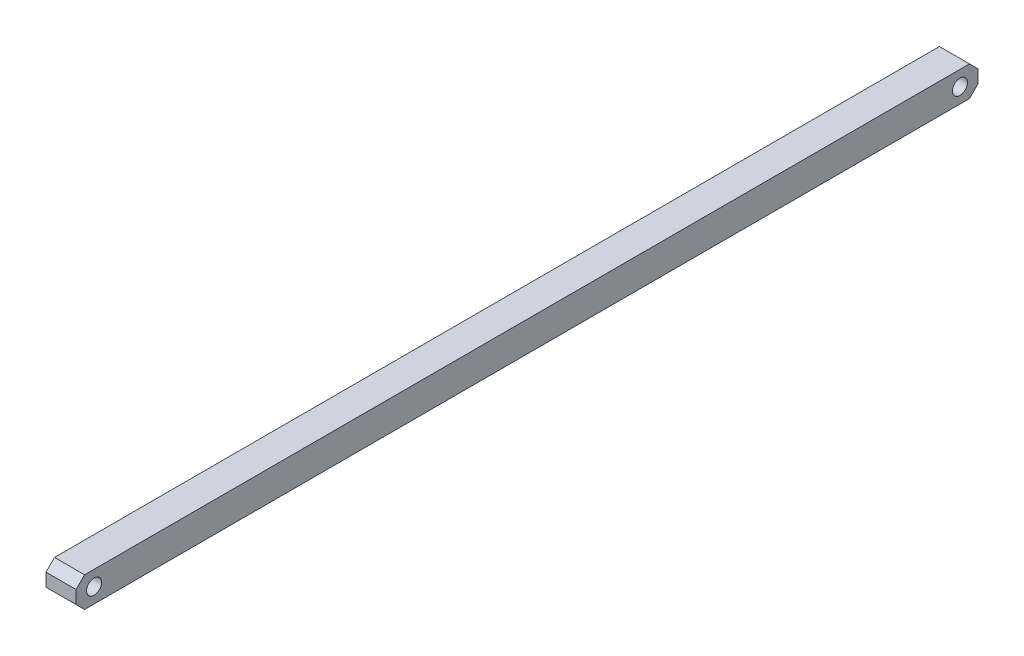
ISO-10303-21;
HEADER;
FILE_DESCRIPTION(('STEP AP214'),'2;1');
FILE_NAME('part.step','',(''),(''),'','','');
FILE_SCHEMA(('AUTOMOTIVE_DESIGN { 1 0 10303 214 1 1 1 1 }'));
ENDSEC;
DATA;
#1=APPLICATION_CONTEXT('core data for automotive mechanical design processes');
#2=APPLICATION_PROTOCOL_DEFINITION('international standard','automotive_design',2000,#1);
#3=PRODUCT_CONTEXT('',#1,'mechanical');
#4=PRODUCT('Part','Part','',(#3));
#5=PRODUCT_RELATED_PRODUCT_CATEGORY('part','',(#4));
#6=PRODUCT_DEFINITION_FORMATION('','',#4);
#7=PRODUCT_DEFINITION_CONTEXT('part definition',#1,'design');
#8=PRODUCT_DEFINITION('design','',#6,#7);
#9=PRODUCT_DEFINITION_SHAPE('','',#8);
#10=(LENGTH_UNIT() NAMED_UNIT(*) SI_UNIT(.MILLI.,.METRE.));
#11=(NAMED_UNIT(*) PLANE_ANGLE_UNIT() SI_UNIT($,.RADIAN.));
#12=(NAMED_UNIT(*) SI_UNIT($,.STERADIAN.) SOLID_ANGLE_UNIT());
#13=UNCERTAINTY_MEASURE_WITH_UNIT(LENGTH_MEASURE(1.E-05),#10,'distance_accuracy_value','');
#14=(GEOMETRIC_REPRESENTATION_CONTEXT(3) GLOBAL_UNCERTAINTY_ASSIGNED_CONTEXT((#13)) GLOBAL_UNIT_ASSIGNED_CONTEXT((#10,
#11,#12)) REPRESENTATION_CONTEXT('',''));
#15=CARTESIAN_POINT('',(0.,0.,0.));
#16=DIRECTION('',(0.,0.,1.));
#17=DIRECTION('',(1.,0.,0.));
#18=AXIS2_PLACEMENT_3D('',#15,#16,#17);
#19=CARTESIAN_POINT('',(0.,0.,300.));
#20=DIRECTION('',(1.,0.,0.));
#21=DIRECTION('',(0.,0.,-1.));
#22=AXIS2_PLACEMENT_3D('',#19,#20,#21);
#23=PLANE('',#22);
#24=CARTESIAN_POINT('',(0.,-5.,6.));
#25=DIRECTION('',(1.,0.,0.));
#26=DIRECTION('',(0.,1.,0.));
#27=AXIS2_PLACEMENT_3D('',#24,#25,#26);
#28=CIRCLE('',#27,2.5);
#29=CARTESIAN_POINT('',(0.,-2.5,6.));
#30=VERTEX_POINT('',#29);
#31=EDGE_CURVE('E165',#30,#30,#28,.T.);
#32=ORIENTED_EDGE('',*,*,#31,.T.);
#33=EDGE_LOOP('',(#32));
#34=FACE_BOUND('',#33,.T.);
#35=CARTESIAN_POINT('',(0.,-5.,294.));
#36=DIRECTION('',(1.,0.,0.));
#37=DIRECTION('',(0.,-1.,0.));
#38=AXIS2_PLACEMENT_3D('',#35,#36,#37);
#39=CIRCLE('',#38,2.49999999999997);
#40=CARTESIAN_POINT('',(0.,-7.49999999999997,294.));
#41=VERTEX_POINT('',#40);
#42=EDGE_CURVE('E174',#41,#41,#39,.T.);
#43=ORIENTED_EDGE('',*,*,#42,.T.);
#44=EDGE_LOOP('',(#43));
#45=FACE_BOUND('',#44,.T.);
#46=DIRECTION('',(0.,-1.,0.));
#47=VECTOR('',#46,1.);
#48=CARTESIAN_POINT('',(0.,0.,0.));
#49=LINE('',#48,#47);
#50=CARTESIAN_POINT('',(0.,-2.82842712474619,0.));
#51=VERTEX_POINT('',#50);
#52=CARTESIAN_POINT('',(0.,-7.17157287525381,0.));
#53=VERTEX_POINT('',#52);
#54=EDGE_CURVE('E134',#51,#53,#49,.T.);
#55=ORIENTED_EDGE('',*,*,#54,.T.);
#56=DIRECTION('',(0.,-0.707106781186548,0.707106781186548));
#57=VECTOR('',#56,1.);
#58=CARTESIAN_POINT('',(0.,-7.17157287525381,0.));
#59=LINE('',#58,#57);
#60=CARTESIAN_POINT('',(0.,-10.,2.82842712474619));
#61=VERTEX_POINT('',#60);
#62=EDGE_CURVE('E112',#53,#61,#59,.T.);
#63=ORIENTED_EDGE('',*,*,#62,.T.);
#64=DIRECTION('',(0.,0.,-1.));
#65=VECTOR('',#64,1.);
#66=CARTESIAN_POINT('',(0.,-10.,300.));
#67=LINE('',#66,#65);
#68=CARTESIAN_POINT('',(0.,-10.,297.171572875254));
#69=VERTEX_POINT('',#68);
#70=EDGE_CURVE('E11',#69,#61,#67,.T.);
#71=ORIENTED_EDGE('',*,*,#70,.F.);
#72=DIRECTION('',(0.,0.707106781186549,0.707106781186546));
#73=VECTOR('',#72,1.);
#74=CARTESIAN_POINT('',(0.,-7.17157287525381,300.));
#75=LINE('',#74,#73);
#76=CARTESIAN_POINT('',(0.,-7.17157287525381,300.));
#77=VERTEX_POINT('',#76);
#78=EDGE_CURVE('E160',#69,#77,#75,.T.);
#79=ORIENTED_EDGE('',*,*,#78,.T.);
#80=DIRECTION('',(0.,-1.,0.));
#81=VECTOR('',#80,1.);
#82=CARTESIAN_POINT('',(0.,0.,300.));
#83=LINE('',#82,#81);
#84=CARTESIAN_POINT('',(0.,-2.82842712474619,300.));
#85=VERTEX_POINT('',#84);
#86=EDGE_CURVE('E133',#85,#77,#83,.T.);
#87=ORIENTED_EDGE('',*,*,#86,.F.);
#88=DIRECTION('',(0.,0.707106781186548,-0.707106781186547));
#89=VECTOR('',#88,1.);
#90=CARTESIAN_POINT('',(0.,0.,297.171572875254));
#91=LINE('',#90,#89);
#92=CARTESIAN_POINT('',(0.,0.,297.171572875254));
#93=VERTEX_POINT('',#92);
#94=EDGE_CURVE('E59',#85,#93,#91,.T.);
#95=ORIENTED_EDGE('',*,*,#94,.T.);
#96=DIRECTION('',(0.,0.,-1.));
#97=VECTOR('',#96,1.);
#98=CARTESIAN_POINT('',(0.,0.,300.));
#99=LINE('',#98,#97);
#100=CARTESIAN_POINT('',(0.,0.,2.82842712474618));
#101=VERTEX_POINT('',#100);
#102=EDGE_CURVE('E125',#93,#101,#99,.T.);
#103=ORIENTED_EDGE('',*,*,#102,.T.);
#104=DIRECTION('',(0.,-0.707106781186548,-0.707106781186547));
#105=VECTOR('',#104,1.);
#106=CARTESIAN_POINT('',(0.,0.,2.82842712474618));
#107=LINE('',#106,#105);
#108=EDGE_CURVE('E144',#101,#51,#107,.T.);
#109=ORIENTED_EDGE('',*,*,#108,.T.);
#110=EDGE_LOOP('',(#55,#63,#71,#79,#87,#95,#103,#109));
#111=FACE_BOUND('',#110,.T.);
#112=ADVANCED_FACE('F37',(#34,#45,#111),#23,.F.);
#113=CARTESIAN_POINT('',(0.,-10.,300.));
#114=DIRECTION('',(0.,1.,0.));
#115=DIRECTION('',(0.,0.,1.));
#116=AXIS2_PLACEMENT_3D('',#113,#114,#115);
#117=PLANE('',#116);
#118=ORIENTED_EDGE('',*,*,#70,.T.);
#119=DIRECTION('',(1.,0.,0.));
#120=VECTOR('',#119,1.);
#121=CARTESIAN_POINT('',(0.,-10.,2.82842712474619));
#122=LINE('',#121,#120);
#123=CARTESIAN_POINT('',(10.,-10.,2.82842712474619));
#124=VERTEX_POINT('',#123);
#125=EDGE_CURVE('E103',#61,#124,#122,.T.);
#126=ORIENTED_EDGE('',*,*,#125,.T.);
#127=DIRECTION('',(0.,0.,-1.));
#128=VECTOR('',#127,1.);
#129=CARTESIAN_POINT('',(10.,-10.,300.));
#130=LINE('',#129,#128);
#131=CARTESIAN_POINT('',(10.,-10.,297.171572875254));
#132=VERTEX_POINT('',#131);
#133=EDGE_CURVE('E44',#132,#124,#130,.T.);
#134=ORIENTED_EDGE('',*,*,#133,.F.);
#135=DIRECTION('',(1.,0.,0.));
#136=VECTOR('',#135,1.);
#137=CARTESIAN_POINT('',(0.,-10.,297.171572875254));
#138=LINE('',#137,#136);
#139=EDGE_CURVE('E154',#69,#132,#138,.T.);
#140=ORIENTED_EDGE('',*,*,#139,.F.);
#141=EDGE_LOOP('',(#118,#126,#134,#140));
#142=FACE_BOUND('',#141,.T.);
#143=ADVANCED_FACE('F116',(#142),#117,.F.);
#144=CARTESIAN_POINT('',(10.,0.,300.));
#145=DIRECTION('',(-1.,0.,0.));
#146=DIRECTION('',(0.,-1.,0.));
#147=AXIS2_PLACEMENT_3D('',#144,#145,#146);
#148=PLANE('',#147);
#149=CARTESIAN_POINT('',(10.,-5.,6.));
#150=DIRECTION('',(1.,0.,0.));
#151=DIRECTION('',(0.,1.,0.));
#152=AXIS2_PLACEMENT_3D('',#149,#150,#151);
#153=CIRCLE('',#152,2.5);
#154=CARTESIAN_POINT('',(10.,-2.5,6.));
#155=VERTEX_POINT('',#154);
#156=EDGE_CURVE('E119',#155,#155,#153,.T.);
#157=ORIENTED_EDGE('',*,*,#156,.F.);
#158=EDGE_LOOP('',(#157));
#159=FACE_BOUND('',#158,.T.);
#160=CARTESIAN_POINT('',(10.,-5.,294.));
#161=DIRECTION('',(1.,0.,0.));
#162=DIRECTION('',(0.,-1.,0.));
#163=AXIS2_PLACEMENT_3D('',#160,#161,#162);
#164=CIRCLE('',#163,2.49999999999997);
#165=CARTESIAN_POINT('',(10.,-7.49999999999997,294.));
#166=VERTEX_POINT('',#165);
#167=EDGE_CURVE('E157',#166,#166,#164,.T.);
#168=ORIENTED_EDGE('',*,*,#167,.F.);
#169=EDGE_LOOP('',(#168));
#170=FACE_BOUND('',#169,.T.);
#171=ORIENTED_EDGE('',*,*,#133,.T.);
#172=DIRECTION('',(0.,-0.707106781186548,0.707106781186548));
#173=VECTOR('',#172,1.);
#174=CARTESIAN_POINT('',(10.,-7.17157287525381,0.));
#175=LINE('',#174,#173);
#176=CARTESIAN_POINT('',(10.,-7.17157287525381,0.));
#177=VERTEX_POINT('',#176);
#178=EDGE_CURVE('E100',#177,#124,#175,.T.);
#179=ORIENTED_EDGE('',*,*,#178,.F.);
#180=DIRECTION('',(0.,1.,0.));
#181=VECTOR('',#180,1.);
#182=CARTESIAN_POINT('',(10.,0.,0.));
#183=LINE('',#182,#181);
#184=CARTESIAN_POINT('',(10.,-2.82842712474619,0.));
#185=VERTEX_POINT('',#184);
#186=EDGE_CURVE('E131',#177,#185,#183,.T.);
#187=ORIENTED_EDGE('',*,*,#186,.T.);
#188=DIRECTION('',(0.,-0.707106781186548,-0.707106781186547));
#189=VECTOR('',#188,1.);
#190=CARTESIAN_POINT('',(10.,0.,2.82842712474618));
#191=LINE('',#190,#189);
#192=CARTESIAN_POINT('',(10.,0.,2.82842712474618));
#193=VERTEX_POINT('',#192);
#194=EDGE_CURVE('E111',#193,#185,#191,.T.);
#195=ORIENTED_EDGE('',*,*,#194,.F.);
#196=DIRECTION('',(0.,0.,-1.));
#197=VECTOR('',#196,1.);
#198=CARTESIAN_POINT('',(10.,0.,300.));
#199=LINE('',#198,#197);
#200=CARTESIAN_POINT('',(10.,0.,297.171572875254));
#201=VERTEX_POINT('',#200);
#202=EDGE_CURVE('E123',#201,#193,#199,.T.);
#203=ORIENTED_EDGE('',*,*,#202,.F.);
#204=DIRECTION('',(0.,0.707106781186548,-0.707106781186547));
#205=VECTOR('',#204,1.);
#206=CARTESIAN_POINT('',(10.,0.,297.171572875254));
#207=LINE('',#206,#205);
#208=CARTESIAN_POINT('',(10.,-2.82842712474619,300.));
#209=VERTEX_POINT('',#208);
#210=EDGE_CURVE('E151',#209,#201,#207,.T.);
#211=ORIENTED_EDGE('',*,*,#210,.F.);
#212=DIRECTION('',(0.,1.,0.));
#213=VECTOR('',#212,1.);
#214=CARTESIAN_POINT('',(10.,0.,300.));
#215=LINE('',#214,#213);
#216=CARTESIAN_POINT('',(10.,-7.17157287525381,300.));
#217=VERTEX_POINT('',#216);
#218=EDGE_CURVE('E130',#217,#209,#215,.T.);
#219=ORIENTED_EDGE('',*,*,#218,.F.);
#220=DIRECTION('',(0.,0.707106781186549,0.707106781186546));
#221=VECTOR('',#220,1.);
#222=CARTESIAN_POINT('',(10.,-7.17157287525381,300.));
#223=LINE('',#222,#221);
#224=EDGE_CURVE('E51',#132,#217,#223,.T.);
#225=ORIENTED_EDGE('',*,*,#224,.F.);
#226=EDGE_LOOP('',(#171,#179,#187,#195,#203,#211,#219,#225));
#227=FACE_BOUND('',#226,.T.);
#228=ADVANCED_FACE('F121',(#159,#170,#227),#148,.F.);
#229=CARTESIAN_POINT('',(0.,0.,300.));
#230=DIRECTION('',(0.,-1.,0.));
#231=DIRECTION('',(0.,0.,-1.));
#232=AXIS2_PLACEMENT_3D('',#229,#230,#231);
#233=PLANE('',#232);
#234=ORIENTED_EDGE('',*,*,#102,.F.);
#235=DIRECTION('',(1.,0.,0.));
#236=VECTOR('',#235,1.);
#237=CARTESIAN_POINT('',(0.,0.,297.171572875254));
#238=LINE('',#237,#236);
#239=EDGE_CURVE('E152',#93,#201,#238,.T.);
#240=ORIENTED_EDGE('',*,*,#239,.T.);
#241=ORIENTED_EDGE('',*,*,#202,.T.);
#242=DIRECTION('',(1.,0.,0.));
#243=VECTOR('',#242,1.);
#244=CARTESIAN_POINT('',(0.,0.,2.82842712474618));
#245=LINE('',#244,#243);
#246=EDGE_CURVE('E142',#101,#193,#245,.T.);
#247=ORIENTED_EDGE('',*,*,#246,.F.);
#248=EDGE_LOOP('',(#234,#240,#241,#247));
#249=FACE_BOUND('',#248,.T.);
#250=ADVANCED_FACE('F183',(#249),#233,.F.);
#251=CARTESIAN_POINT('',(0.,0.,300.));
#252=DIRECTION('',(0.,0.,1.));
#253=DIRECTION('',(1.,0.,0.));
#254=AXIS2_PLACEMENT_3D('',#251,#252,#253);
#255=PLANE('',#254);
#256=DIRECTION('',(1.,0.,0.));
#257=VECTOR('',#256,1.);
#258=CARTESIAN_POINT('',(0.,-7.17157287525381,300.));
#259=LINE('',#258,#257);
#260=EDGE_CURVE('E163',#77,#217,#259,.T.);
#261=ORIENTED_EDGE('',*,*,#260,.T.);
#262=ORIENTED_EDGE('',*,*,#218,.T.);
#263=DIRECTION('',(1.,0.,0.));
#264=VECTOR('',#263,1.);
#265=CARTESIAN_POINT('',(0.,-2.82842712474619,300.));
#266=LINE('',#265,#264);
#267=EDGE_CURVE('E155',#85,#209,#266,.T.);
#268=ORIENTED_EDGE('',*,*,#267,.F.);
#269=ORIENTED_EDGE('',*,*,#86,.T.);
#270=EDGE_LOOP('',(#261,#262,#268,#269));
#271=FACE_BOUND('',#270,.T.);
#272=ADVANCED_FACE('F190',(#271),#255,.T.);
#273=CARTESIAN_POINT('',(0.,0.,0.));
#274=DIRECTION('',(0.,0.,1.));
#275=DIRECTION('',(1.,0.,0.));
#276=AXIS2_PLACEMENT_3D('',#273,#274,#275);
#277=PLANE('',#276);
#278=ORIENTED_EDGE('',*,*,#186,.F.);
#279=DIRECTION('',(1.,0.,0.));
#280=VECTOR('',#279,1.);
#281=CARTESIAN_POINT('',(0.,-7.17157287525381,0.));
#282=LINE('',#281,#280);
#283=EDGE_CURVE('E106',#53,#177,#282,.T.);
#284=ORIENTED_EDGE('',*,*,#283,.F.);
#285=ORIENTED_EDGE('',*,*,#54,.F.);
#286=DIRECTION('',(1.,0.,0.));
#287=VECTOR('',#286,1.);
#288=CARTESIAN_POINT('',(0.,-2.82842712474619,0.));
#289=LINE('',#288,#287);
#290=EDGE_CURVE('E137',#51,#185,#289,.T.);
#291=ORIENTED_EDGE('',*,*,#290,.T.);
#292=EDGE_LOOP('',(#278,#284,#285,#291));
#293=FACE_BOUND('',#292,.T.);
#294=ADVANCED_FACE('F204',(#293),#277,.F.);
#295=CARTESIAN_POINT('',(0.,0.,2.82842712474618));
#296=DIRECTION('',(0.,-0.707106781186547,0.707106781186548));
#297=DIRECTION('',(0.,-0.707106781186548,-0.707106781186547));
#298=AXIS2_PLACEMENT_3D('',#295,#296,#297);
#299=PLANE('',#298);
#300=ORIENTED_EDGE('',*,*,#194,.T.);
#301=ORIENTED_EDGE('',*,*,#290,.F.);
#302=ORIENTED_EDGE('',*,*,#108,.F.);
#303=ORIENTED_EDGE('',*,*,#246,.T.);
#304=EDGE_LOOP('',(#300,#301,#302,#303));
#305=FACE_BOUND('',#304,.T.);
#306=ADVANCED_FACE('F228',(#305),#299,.F.);
#307=CARTESIAN_POINT('',(0.,-7.17157287525381,0.));
#308=DIRECTION('',(0.,0.707106781186548,0.707106781186548));
#309=DIRECTION('',(0.,-0.707106781186548,0.707106781186548));
#310=AXIS2_PLACEMENT_3D('',#307,#308,#309);
#311=PLANE('',#310);
#312=ORIENTED_EDGE('',*,*,#178,.T.);
#313=ORIENTED_EDGE('',*,*,#125,.F.);
#314=ORIENTED_EDGE('',*,*,#62,.F.);
#315=ORIENTED_EDGE('',*,*,#283,.T.);
#316=EDGE_LOOP('',(#312,#313,#314,#315));
#317=FACE_BOUND('',#316,.T.);
#318=ADVANCED_FACE('F102',(#317),#311,.F.);
#319=CARTESIAN_POINT('',(0.,0.,297.171572875254));
#320=DIRECTION('',(0.,-0.707106781186547,-0.707106781186548));
#321=DIRECTION('',(0.,0.707106781186548,-0.707106781186547));
#322=AXIS2_PLACEMENT_3D('',#319,#320,#321);
#323=PLANE('',#322);
#324=ORIENTED_EDGE('',*,*,#210,.T.);
#325=ORIENTED_EDGE('',*,*,#239,.F.);
#326=ORIENTED_EDGE('',*,*,#94,.F.);
#327=ORIENTED_EDGE('',*,*,#267,.T.);
#328=EDGE_LOOP('',(#324,#325,#326,#327));
#329=FACE_BOUND('',#328,.T.);
#330=ADVANCED_FACE('F211',(#329),#323,.F.);
#331=CARTESIAN_POINT('',(0.,-7.17157287525381,300.));
#332=DIRECTION('',(0.,0.707106781186546,-0.707106781186549));
#333=DIRECTION('',(0.,0.707106781186549,0.707106781186546));
#334=AXIS2_PLACEMENT_3D('',#331,#332,#333);
#335=PLANE('',#334);
#336=ORIENTED_EDGE('',*,*,#224,.T.);
#337=ORIENTED_EDGE('',*,*,#260,.F.);
#338=ORIENTED_EDGE('',*,*,#78,.F.);
#339=ORIENTED_EDGE('',*,*,#139,.T.);
#340=EDGE_LOOP('',(#336,#337,#338,#339));
#341=FACE_BOUND('',#340,.T.);
#342=ADVANCED_FACE('F214',(#341),#335,.F.);
#343=CARTESIAN_POINT('',(0.,-5.,294.));
#344=DIRECTION('',(1.,0.,0.));
#345=DIRECTION('',(0.,1.,0.));
#346=AXIS2_PLACEMENT_3D('',#343,#344,#345);
#347=CYLINDRICAL_SURFACE('',#346,2.49999999999997);
#348=ORIENTED_EDGE('',*,*,#42,.F.);
#349=EDGE_LOOP('',(#348));
#350=FACE_BOUND('',#349,.T.);
#351=ORIENTED_EDGE('',*,*,#167,.T.);
#352=EDGE_LOOP('',(#351));
#353=FACE_BOUND('',#352,.T.);
#354=ADVANCED_FACE('F180',(#350,#353),#347,.F.);
#355=CARTESIAN_POINT('',(0.,-5.,6.));
#356=DIRECTION('',(1.,0.,0.));
#357=DIRECTION('',(0.,1.,0.));
#358=AXIS2_PLACEMENT_3D('',#355,#356,#357);
#359=CYLINDRICAL_SURFACE('',#358,2.5);
#360=ORIENTED_EDGE('',*,*,#31,.F.);
#361=EDGE_LOOP('',(#360));
#362=FACE_BOUND('',#361,.T.);
#363=ORIENTED_EDGE('',*,*,#156,.T.);
#364=EDGE_LOOP('',(#363));
#365=FACE_BOUND('',#364,.T.);
#366=ADVANCED_FACE('F221',(#362,#365),#359,.F.);
#367=CLOSED_SHELL('',(#112,#143,#228,#250,#272,#294,#306,#318,#330,#342,#354,#366));
#368=MANIFOLD_SOLID_BREP('B2',#367);
#369=ADVANCED_BREP_SHAPE_REPRESENTATION('',(#18,#368),#14);
#370=SHAPE_DEFINITION_REPRESENTATION(#9,#369);
ENDSEC;
END-ISO-10303-21;
